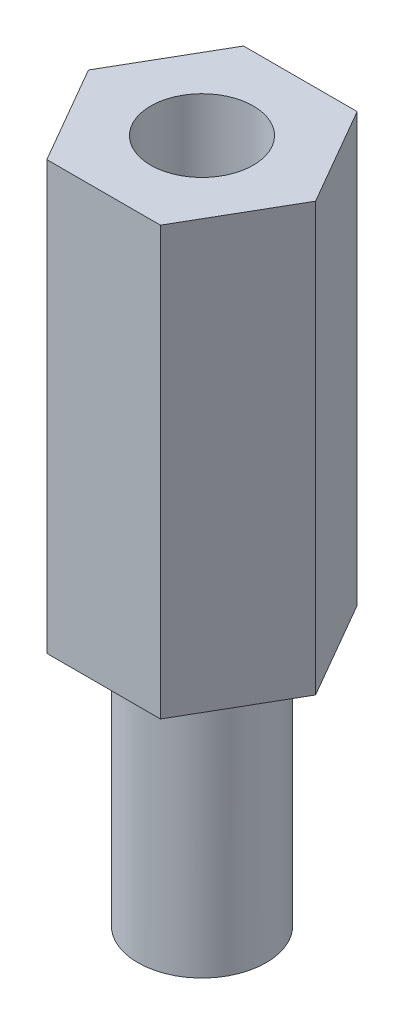
ISO-10303-21;
HEADER;
FILE_DESCRIPTION(('STEP AP214'),'2;1');
FILE_NAME('part.step','',(''),(''),'','','');
FILE_SCHEMA(('AUTOMOTIVE_DESIGN { 1 0 10303 214 1 1 1 1 }'));
ENDSEC;
DATA;
#1=APPLICATION_CONTEXT('core data for automotive mechanical design processes');
#2=APPLICATION_PROTOCOL_DEFINITION('international standard','automotive_design',2000,#1);
#3=PRODUCT_CONTEXT('',#1,'mechanical');
#4=PRODUCT('Part','Part','',(#3));
#5=PRODUCT_RELATED_PRODUCT_CATEGORY('part','',(#4));
#6=PRODUCT_DEFINITION_FORMATION('','',#4);
#7=PRODUCT_DEFINITION_CONTEXT('part definition',#1,'design');
#8=PRODUCT_DEFINITION('design','',#6,#7);
#9=PRODUCT_DEFINITION_SHAPE('','',#8);
#10=(LENGTH_UNIT() NAMED_UNIT(*) SI_UNIT(.MILLI.,.METRE.));
#11=(NAMED_UNIT(*) PLANE_ANGLE_UNIT() SI_UNIT($,.RADIAN.));
#12=(NAMED_UNIT(*) SI_UNIT($,.STERADIAN.) SOLID_ANGLE_UNIT());
#13=UNCERTAINTY_MEASURE_WITH_UNIT(LENGTH_MEASURE(1.E-05),#10,'distance_accuracy_value','');
#14=(GEOMETRIC_REPRESENTATION_CONTEXT(3) GLOBAL_UNCERTAINTY_ASSIGNED_CONTEXT((#13)) GLOBAL_UNIT_ASSIGNED_CONTEXT((#10,
#11,#12)) REPRESENTATION_CONTEXT('',''));
#15=CARTESIAN_POINT('',(0.,0.,0.));
#16=DIRECTION('',(0.,0.,1.));
#17=DIRECTION('',(1.,0.,0.));
#18=AXIS2_PLACEMENT_3D('',#15,#16,#17);
#19=CARTESIAN_POINT('',(0.,10.,0.));
#20=DIRECTION('',(0.,1.,0.));
#21=DIRECTION('',(0.,0.,1.));
#22=AXIS2_PLACEMENT_3D('',#19,#20,#21);
#23=PLANE('',#22);
#24=DIRECTION('',(0.499999999999995,0.,-0.866025403784442));
#25=VECTOR('',#24,1.);
#26=CARTESIAN_POINT('',(1.32790561913616,10.,2.29999999999998));
#27=LINE('',#26,#25);
#28=CARTESIAN_POINT('',(1.32790561913616,10.,2.29999999999998));
#29=VERTEX_POINT('',#28);
#30=CARTESIAN_POINT('',(2.65581123827227,10.,0.));
#31=VERTEX_POINT('',#30);
#32=EDGE_CURVE('E134',#29,#31,#27,.T.);
#33=ORIENTED_EDGE('',*,*,#32,.T.);
#34=DIRECTION('',(-0.500000000000001,0.,-0.866025403784438));
#35=VECTOR('',#34,1.);
#36=CARTESIAN_POINT('',(2.65581123827227,10.,0.));
#37=LINE('',#36,#35);
#38=CARTESIAN_POINT('',(1.32790561913613,10.,-2.3));
#39=VERTEX_POINT('',#38);
#40=EDGE_CURVE('E92',#31,#39,#37,.T.);
#41=ORIENTED_EDGE('',*,*,#40,.T.);
#42=DIRECTION('',(-1.,0.,0.));
#43=VECTOR('',#42,1.);
#44=CARTESIAN_POINT('',(1.32790561913613,10.,-2.3));
#45=LINE('',#44,#43);
#46=CARTESIAN_POINT('',(-1.32790561913615,10.,-2.29999999999999));
#47=VERTEX_POINT('',#46);
#48=EDGE_CURVE('E105',#39,#47,#45,.T.);
#49=ORIENTED_EDGE('',*,*,#48,.T.);
#50=DIRECTION('',(-0.499999999999995,0.,0.866025403784442));
#51=VECTOR('',#50,1.);
#52=CARTESIAN_POINT('',(-1.32790561913615,10.,-2.29999999999999));
#53=LINE('',#52,#51);
#54=CARTESIAN_POINT('',(-2.65581123827227,10.,0.));
#55=VERTEX_POINT('',#54);
#56=EDGE_CURVE('E99',#47,#55,#53,.T.);
#57=ORIENTED_EDGE('',*,*,#56,.T.);
#58=DIRECTION('',(0.500000000000007,0.,0.866025403784435));
#59=VECTOR('',#58,1.);
#60=CARTESIAN_POINT('',(-2.65581123827227,10.,0.));
#61=LINE('',#60,#59);
#62=CARTESIAN_POINT('',(-1.32790561913612,10.,2.30000000000001));
#63=VERTEX_POINT('',#62);
#64=EDGE_CURVE('E103',#55,#63,#61,.T.);
#65=ORIENTED_EDGE('',*,*,#64,.T.);
#66=DIRECTION('',(1.,0.,0.));
#67=VECTOR('',#66,1.);
#68=CARTESIAN_POINT('',(-1.32790561913612,10.,2.30000000000001));
#69=LINE('',#68,#67);
#70=EDGE_CURVE('E54',#63,#29,#69,.T.);
#71=ORIENTED_EDGE('',*,*,#70,.T.);
#72=EDGE_LOOP('',(#33,#41,#49,#57,#65,#71));
#73=FACE_BOUND('',#72,.T.);
#74=CARTESIAN_POINT('',(0.,10.,0.));
#75=DIRECTION('',(0.,1.,0.));
#76=DIRECTION('',(0.,0.,1.));
#77=AXIS2_PLACEMENT_3D('',#74,#75,#76);
#78=CIRCLE('',#77,1.2);
#79=CARTESIAN_POINT('',(0.,10.,1.2));
#80=VERTEX_POINT('',#79);
#81=EDGE_CURVE('E127',#80,#80,#78,.T.);
#82=ORIENTED_EDGE('',*,*,#81,.F.);
#83=EDGE_LOOP('',(#82));
#84=FACE_BOUND('',#83,.T.);
#85=ADVANCED_FACE('F37',(#73,#84),#23,.T.);
#86=CARTESIAN_POINT('',(0.,0.,0.));
#87=DIRECTION('',(0.,1.,0.));
#88=DIRECTION('',(0.,0.,1.));
#89=AXIS2_PLACEMENT_3D('',#86,#87,#88);
#90=PLANE('',#89);
#91=CARTESIAN_POINT('',(0.,0.,0.));
#92=DIRECTION('',(0.,1.,0.));
#93=DIRECTION('',(0.,0.,1.));
#94=AXIS2_PLACEMENT_3D('',#91,#92,#93);
#95=CIRCLE('',#94,1.5);
#96=CARTESIAN_POINT('',(0.,0.,1.5));
#97=VERTEX_POINT('',#96);
#98=EDGE_CURVE('E11',#97,#97,#95,.F.);
#99=ORIENTED_EDGE('',*,*,#98,.F.);
#100=EDGE_LOOP('',(#99));
#101=FACE_BOUND('',#100,.T.);
#102=DIRECTION('',(0.499999999999995,0.,-0.866025403784442));
#103=VECTOR('',#102,1.);
#104=CARTESIAN_POINT('',(1.32790561913616,0.,2.29999999999998));
#105=LINE('',#104,#103);
#106=CARTESIAN_POINT('',(1.32790561913616,0.,2.29999999999998));
#107=VERTEX_POINT('',#106);
#108=CARTESIAN_POINT('',(2.65581123827227,0.,0.));
#109=VERTEX_POINT('',#108);
#110=EDGE_CURVE('E123',#107,#109,#105,.T.);
#111=ORIENTED_EDGE('',*,*,#110,.F.);
#112=DIRECTION('',(1.,0.,0.));
#113=VECTOR('',#112,1.);
#114=CARTESIAN_POINT('',(-1.32790561913612,0.,2.30000000000001));
#115=LINE('',#114,#113);
#116=CARTESIAN_POINT('',(-1.32790561913612,0.,2.30000000000001));
#117=VERTEX_POINT('',#116);
#118=EDGE_CURVE('E83',#117,#107,#115,.T.);
#119=ORIENTED_EDGE('',*,*,#118,.F.);
#120=DIRECTION('',(0.500000000000007,0.,0.866025403784435));
#121=VECTOR('',#120,1.);
#122=CARTESIAN_POINT('',(-2.65581123827227,0.,0.));
#123=LINE('',#122,#121);
#124=CARTESIAN_POINT('',(-2.65581123827227,0.,0.));
#125=VERTEX_POINT('',#124);
#126=EDGE_CURVE('E77',#125,#117,#123,.T.);
#127=ORIENTED_EDGE('',*,*,#126,.F.);
#128=DIRECTION('',(-0.499999999999995,0.,0.866025403784442));
#129=VECTOR('',#128,1.);
#130=CARTESIAN_POINT('',(-1.32790561913615,0.,-2.29999999999999));
#131=LINE('',#130,#129);
#132=CARTESIAN_POINT('',(-1.32790561913615,0.,-2.29999999999999));
#133=VERTEX_POINT('',#132);
#134=EDGE_CURVE('E113',#133,#125,#131,.T.);
#135=ORIENTED_EDGE('',*,*,#134,.F.);
#136=DIRECTION('',(-1.,0.,0.));
#137=VECTOR('',#136,1.);
#138=CARTESIAN_POINT('',(1.32790561913613,0.,-2.3));
#139=LINE('',#138,#137);
#140=CARTESIAN_POINT('',(1.32790561913613,0.,-2.3));
#141=VERTEX_POINT('',#140);
#142=EDGE_CURVE('E129',#141,#133,#139,.T.);
#143=ORIENTED_EDGE('',*,*,#142,.F.);
#144=DIRECTION('',(-0.500000000000001,0.,-0.866025403784438));
#145=VECTOR('',#144,1.);
#146=CARTESIAN_POINT('',(2.65581123827227,0.,0.));
#147=LINE('',#146,#145);
#148=EDGE_CURVE('E126',#109,#141,#147,.T.);
#149=ORIENTED_EDGE('',*,*,#148,.F.);
#150=EDGE_LOOP('',(#111,#119,#127,#135,#143,#149));
#151=FACE_BOUND('',#150,.T.);
#152=ADVANCED_FACE('F146',(#101,#151),#90,.F.);
#153=CARTESIAN_POINT('',(1.32790561913616,10.,2.29999999999998));
#154=DIRECTION('',(-0.866025403784442,0.,-0.499999999999995));
#155=DIRECTION('',(-0.499999999999995,0.,0.866025403784442));
#156=AXIS2_PLACEMENT_3D('',#153,#154,#155);
#157=PLANE('',#156);
#158=ORIENTED_EDGE('',*,*,#110,.T.);
#159=DIRECTION('',(0.,-1.,0.));
#160=VECTOR('',#159,1.);
#161=CARTESIAN_POINT('',(2.65581123827227,10.,0.));
#162=LINE('',#161,#160);
#163=EDGE_CURVE('E46',#31,#109,#162,.T.);
#164=ORIENTED_EDGE('',*,*,#163,.F.);
#165=ORIENTED_EDGE('',*,*,#32,.F.);
#166=DIRECTION('',(0.,-1.,0.));
#167=VECTOR('',#166,1.);
#168=CARTESIAN_POINT('',(1.32790561913616,10.,2.29999999999998));
#169=LINE('',#168,#167);
#170=EDGE_CURVE('E119',#29,#107,#169,.T.);
#171=ORIENTED_EDGE('',*,*,#170,.T.);
#172=EDGE_LOOP('',(#158,#164,#165,#171));
#173=FACE_BOUND('',#172,.T.);
#174=ADVANCED_FACE('F39',(#173),#157,.F.);
#175=CARTESIAN_POINT('',(2.65581123827227,10.,0.));
#176=DIRECTION('',(-0.866025403784438,0.,0.500000000000001));
#177=DIRECTION('',(0.500000000000001,0.,0.866025403784438));
#178=AXIS2_PLACEMENT_3D('',#175,#176,#177);
#179=PLANE('',#178);
#180=ORIENTED_EDGE('',*,*,#148,.T.);
#181=DIRECTION('',(0.,-1.,0.));
#182=VECTOR('',#181,1.);
#183=CARTESIAN_POINT('',(1.32790561913613,10.,-2.3));
#184=LINE('',#183,#182);
#185=EDGE_CURVE('E138',#39,#141,#184,.T.);
#186=ORIENTED_EDGE('',*,*,#185,.F.);
#187=ORIENTED_EDGE('',*,*,#40,.F.);
#188=ORIENTED_EDGE('',*,*,#163,.T.);
#189=EDGE_LOOP('',(#180,#186,#187,#188));
#190=FACE_BOUND('',#189,.T.);
#191=ADVANCED_FACE('F141',(#190),#179,.F.);
#192=CARTESIAN_POINT('',(1.32790561913613,10.,-2.3));
#193=DIRECTION('',(0.,0.,1.));
#194=DIRECTION('',(1.,0.,0.));
#195=AXIS2_PLACEMENT_3D('',#192,#193,#194);
#196=PLANE('',#195);
#197=ORIENTED_EDGE('',*,*,#142,.T.);
#198=DIRECTION('',(0.,-1.,0.));
#199=VECTOR('',#198,1.);
#200=CARTESIAN_POINT('',(-1.32790561913615,10.,-2.29999999999999));
#201=LINE('',#200,#199);
#202=EDGE_CURVE('E114',#47,#133,#201,.T.);
#203=ORIENTED_EDGE('',*,*,#202,.F.);
#204=ORIENTED_EDGE('',*,*,#48,.F.);
#205=ORIENTED_EDGE('',*,*,#185,.T.);
#206=EDGE_LOOP('',(#197,#203,#204,#205));
#207=FACE_BOUND('',#206,.T.);
#208=ADVANCED_FACE('F149',(#207),#196,.F.);
#209=CARTESIAN_POINT('',(-1.32790561913615,10.,-2.29999999999999));
#210=DIRECTION('',(0.866025403784442,0.,0.499999999999995));
#211=DIRECTION('',(0.499999999999995,0.,-0.866025403784442));
#212=AXIS2_PLACEMENT_3D('',#209,#210,#211);
#213=PLANE('',#212);
#214=ORIENTED_EDGE('',*,*,#134,.T.);
#215=DIRECTION('',(0.,-1.,0.));
#216=VECTOR('',#215,1.);
#217=CARTESIAN_POINT('',(-2.65581123827227,10.,0.));
#218=LINE('',#217,#216);
#219=EDGE_CURVE('E110',#55,#125,#218,.T.);
#220=ORIENTED_EDGE('',*,*,#219,.F.);
#221=ORIENTED_EDGE('',*,*,#56,.F.);
#222=ORIENTED_EDGE('',*,*,#202,.T.);
#223=EDGE_LOOP('',(#214,#220,#221,#222));
#224=FACE_BOUND('',#223,.T.);
#225=ADVANCED_FACE('F111',(#224),#213,.F.);
#226=CARTESIAN_POINT('',(-2.65581123827227,10.,0.));
#227=DIRECTION('',(0.866025403784435,0.,-0.500000000000007));
#228=DIRECTION('',(-0.500000000000007,0.,-0.866025403784435));
#229=AXIS2_PLACEMENT_3D('',#226,#227,#228);
#230=PLANE('',#229);
#231=ORIENTED_EDGE('',*,*,#126,.T.);
#232=DIRECTION('',(0.,-1.,0.));
#233=VECTOR('',#232,1.);
#234=CARTESIAN_POINT('',(-1.32790561913612,10.,2.30000000000001));
#235=LINE('',#234,#233);
#236=EDGE_CURVE('E115',#63,#117,#235,.T.);
#237=ORIENTED_EDGE('',*,*,#236,.F.);
#238=ORIENTED_EDGE('',*,*,#64,.F.);
#239=ORIENTED_EDGE('',*,*,#219,.T.);
#240=EDGE_LOOP('',(#231,#237,#238,#239));
#241=FACE_BOUND('',#240,.T.);
#242=ADVANCED_FACE('F117',(#241),#230,.F.);
#243=CARTESIAN_POINT('',(-1.32790561913612,10.,2.30000000000001));
#244=DIRECTION('',(0.,0.,-1.));
#245=DIRECTION('',(-1.,0.,0.));
#246=AXIS2_PLACEMENT_3D('',#243,#244,#245);
#247=PLANE('',#246);
#248=ORIENTED_EDGE('',*,*,#118,.T.);
#249=ORIENTED_EDGE('',*,*,#170,.F.);
#250=ORIENTED_EDGE('',*,*,#70,.F.);
#251=ORIENTED_EDGE('',*,*,#236,.T.);
#252=EDGE_LOOP('',(#248,#249,#250,#251));
#253=FACE_BOUND('',#252,.T.);
#254=ADVANCED_FACE('F180',(#253),#247,.F.);
#255=CARTESIAN_POINT('',(0.,10.,0.));
#256=DIRECTION('',(0.,-1.,0.));
#257=DIRECTION('',(0.,0.,-1.));
#258=AXIS2_PLACEMENT_3D('',#255,#256,#257);
#259=CYLINDRICAL_SURFACE('',#258,1.2);
#260=ORIENTED_EDGE('',*,*,#81,.T.);
#261=EDGE_LOOP('',(#260));
#262=FACE_BOUND('',#261,.T.);
#263=CARTESIAN_POINT('',(0.,0.,0.));
#264=DIRECTION('',(0.,1.,0.));
#265=DIRECTION('',(0.,0.,1.));
#266=AXIS2_PLACEMENT_3D('',#263,#264,#265);
#267=CIRCLE('',#266,1.2);
#268=CARTESIAN_POINT('',(0.,0.,1.2));
#269=VERTEX_POINT('',#268);
#270=EDGE_CURVE('E153',#269,#269,#267,.T.);
#271=ORIENTED_EDGE('',*,*,#270,.F.);
#272=EDGE_LOOP('',(#271));
#273=FACE_BOUND('',#272,.T.);
#274=ADVANCED_FACE('F183',(#262,#273),#259,.F.);
#275=CARTESIAN_POINT('',(0.,0.,0.));
#276=DIRECTION('',(0.,-1.,0.));
#277=DIRECTION('',(0.,0.,-1.));
#278=AXIS2_PLACEMENT_3D('',#275,#276,#277);
#279=PLANE('',#278);
#280=ORIENTED_EDGE('',*,*,#270,.T.);
#281=EDGE_LOOP('',(#280));
#282=FACE_BOUND('',#281,.T.);
#283=ADVANCED_FACE('F167',(#282),#279,.F.);
#284=CARTESIAN_POINT('',(0.,-6.,0.));
#285=DIRECTION('',(0.,1.,0.));
#286=DIRECTION('',(0.,0.,1.));
#287=AXIS2_PLACEMENT_3D('',#284,#285,#286);
#288=CYLINDRICAL_SURFACE('',#287,1.5);
#289=CARTESIAN_POINT('',(0.,-6.,0.));
#290=DIRECTION('',(0.,-1.,0.));
#291=DIRECTION('',(0.,0.,-1.));
#292=AXIS2_PLACEMENT_3D('',#289,#290,#291);
#293=CIRCLE('',#292,1.5);
#294=CARTESIAN_POINT('',(0.,-6.,-1.5));
#295=VERTEX_POINT('',#294);
#296=EDGE_CURVE('E156',#295,#295,#293,.T.);
#297=ORIENTED_EDGE('',*,*,#296,.F.);
#298=EDGE_LOOP('',(#297));
#299=FACE_BOUND('',#298,.T.);
#300=ORIENTED_EDGE('',*,*,#98,.T.);
#301=EDGE_LOOP('',(#300));
#302=FACE_BOUND('',#301,.T.);
#303=ADVANCED_FACE('F164',(#299,#302),#288,.T.);
#304=CARTESIAN_POINT('',(0.,-6.,0.));
#305=DIRECTION('',(0.,-1.,0.));
#306=DIRECTION('',(0.,0.,-1.));
#307=AXIS2_PLACEMENT_3D('',#304,#305,#306);
#308=PLANE('',#307);
#309=ORIENTED_EDGE('',*,*,#296,.T.);
#310=EDGE_LOOP('',(#309));
#311=FACE_BOUND('',#310,.T.);
#312=ADVANCED_FACE('F162',(#311),#308,.T.);
#313=CLOSED_SHELL('',(#85,#152,#174,#191,#208,#225,#242,#254,#274,#283,#303,#312));
#314=MANIFOLD_SOLID_BREP('B2',#313);
#315=ADVANCED_BREP_SHAPE_REPRESENTATION('',(#18,#314),#14);
#316=SHAPE_DEFINITION_REPRESENTATION(#9,#315);
ENDSEC;
END-ISO-10303-21;
